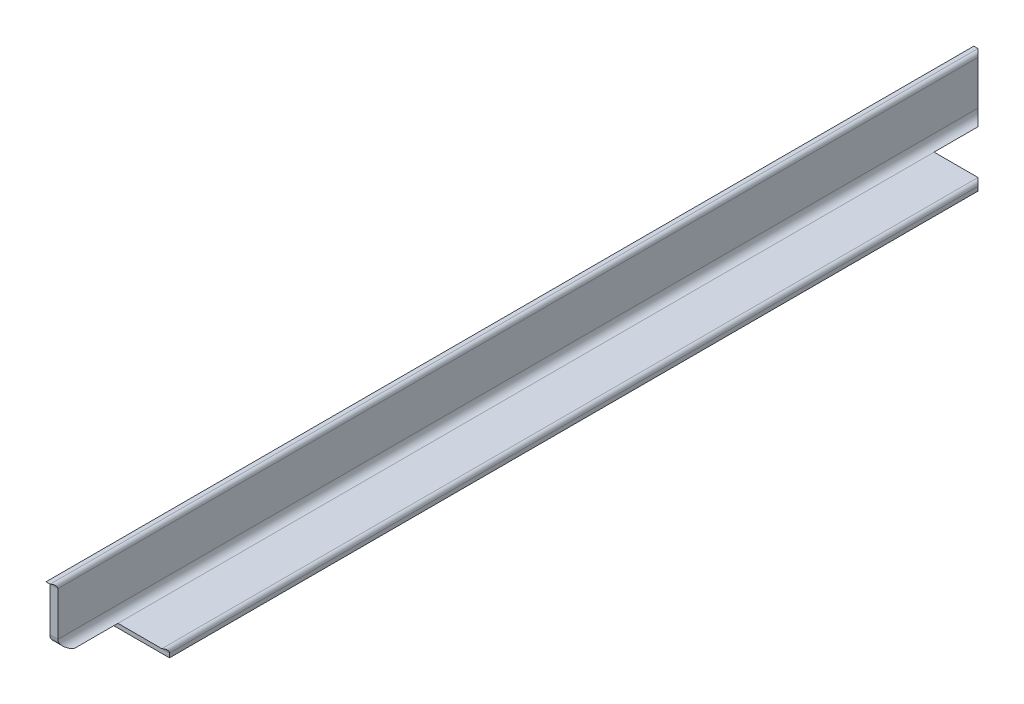
ISO-10303-21;
HEADER;
FILE_DESCRIPTION(('STEP AP214'),'2;1');
FILE_NAME('part.step','',(''),(''),'','','');
FILE_SCHEMA(('AUTOMOTIVE_DESIGN { 1 0 10303 214 1 1 1 1 }'));
ENDSEC;
DATA;
#1=APPLICATION_CONTEXT('core data for automotive mechanical design processes');
#2=APPLICATION_PROTOCOL_DEFINITION('international standard','automotive_design',2000,#1);
#3=PRODUCT_CONTEXT('',#1,'mechanical');
#4=PRODUCT('Part','Part','',(#3));
#5=PRODUCT_RELATED_PRODUCT_CATEGORY('part','',(#4));
#6=PRODUCT_DEFINITION_FORMATION('','',#4);
#7=PRODUCT_DEFINITION_CONTEXT('part definition',#1,'design');
#8=PRODUCT_DEFINITION('design','',#6,#7);
#9=PRODUCT_DEFINITION_SHAPE('','',#8);
#10=(LENGTH_UNIT() NAMED_UNIT(*) SI_UNIT(.MILLI.,.METRE.));
#11=(NAMED_UNIT(*) PLANE_ANGLE_UNIT() SI_UNIT($,.RADIAN.));
#12=(NAMED_UNIT(*) SI_UNIT($,.STERADIAN.) SOLID_ANGLE_UNIT());
#13=UNCERTAINTY_MEASURE_WITH_UNIT(LENGTH_MEASURE(1.E-05),#10,'distance_accuracy_value','');
#14=(GEOMETRIC_REPRESENTATION_CONTEXT(3) GLOBAL_UNCERTAINTY_ASSIGNED_CONTEXT((#13)) GLOBAL_UNIT_ASSIGNED_CONTEXT((#10,
#11,#12)) REPRESENTATION_CONTEXT('',''));
#15=CARTESIAN_POINT('',(0.,0.,0.));
#16=DIRECTION('',(0.,0.,1.));
#17=DIRECTION('',(1.,0.,0.));
#18=AXIS2_PLACEMENT_3D('',#15,#16,#17);
#19=CARTESIAN_POINT('',(498.3479999,4.7624999999999,35.8140000999999));
#20=DIRECTION('',(0.,1.,0.));
#21=DIRECTION('',(0.,0.,1.));
#22=AXIS2_PLACEMENT_3D('',#19,#20,#21);
#23=PLANE('',#22);
#24=DIRECTION('',(0.,0.,1.));
#25=VECTOR('',#24,1.);
#26=CARTESIAN_POINT('',(9.5885,4.7625,9.58850009999965));
#27=LINE('',#26,#25);
#28=CARTESIAN_POINT('',(9.5885,4.7625,9.58850009999965));
#29=VERTEX_POINT('',#28);
#30=CARTESIAN_POINT('',(9.5885,4.76250000000002,35.8140000999996));
#31=VERTEX_POINT('',#30);
#32=EDGE_CURVE('E10',#29,#31,#27,.T.);
#33=ORIENTED_EDGE('',*,*,#32,.T.);
#34=DIRECTION('',(1.,0.,0.));
#35=VECTOR('',#34,1.);
#36=CARTESIAN_POINT('',(0.,4.76250000000002,35.8140000999996));
#37=LINE('',#36,#35);
#38=CARTESIAN_POINT('',(0.,4.76250000000002,35.8140000999996));
#39=VERTEX_POINT('',#38);
#40=EDGE_CURVE('E271',#39,#31,#37,.T.);
#41=ORIENTED_EDGE('',*,*,#40,.F.);
#42=DIRECTION('',(0.,0.,1.));
#43=VECTOR('',#42,1.);
#44=CARTESIAN_POINT('',(0.,4.7625,9.58850009999965));
#45=LINE('',#44,#43);
#46=CARTESIAN_POINT('',(0.,4.7625,9.58850009999965));
#47=VERTEX_POINT('',#46);
#48=EDGE_CURVE('E286',#47,#39,#45,.T.);
#49=ORIENTED_EDGE('',*,*,#48,.F.);
#50=DIRECTION('',(1.,0.,0.));
#51=VECTOR('',#50,1.);
#52=CARTESIAN_POINT('',(0.,4.7625,9.58850009999965));
#53=LINE('',#52,#51);
#54=EDGE_CURVE('E26',#47,#29,#53,.T.);
#55=ORIENTED_EDGE('',*,*,#54,.T.);
#56=EDGE_LOOP('',(#33,#41,#49,#55));
#57=FACE_BOUND('',#56,.T.);
#58=ADVANCED_FACE('F16',(#57),#23,.F.);
#59=CARTESIAN_POINT('',(498.3479999,9.5884999999999,9.5885000999999));
#60=DIRECTION('',(-1.,0.,0.));
#61=DIRECTION('',(0.,0.,1.));
#62=AXIS2_PLACEMENT_3D('',#59,#60,#61);
#63=CYLINDRICAL_SURFACE('',#62,4.826);
#64=CARTESIAN_POINT('',(9.58849999999997,9.5885,9.58850009999965));
#65=DIRECTION('',(0.707106781186546,0.,-0.707106781186549));
#66=DIRECTION('',(-0.707106781186549,0.,-0.707106781186546));
#67=AXIS2_PLACEMENT_3D('',#64,#65,#66);
#68=ELLIPSE('',#67,6.82499465201258,4.826);
#69=CARTESIAN_POINT('',(4.7625,9.5885,4.76250009999965));
#70=VERTEX_POINT('',#69);
#71=EDGE_CURVE('E197',#29,#70,#68,.T.);
#72=ORIENTED_EDGE('',*,*,#71,.F.);
#73=ORIENTED_EDGE('',*,*,#54,.F.);
#74=CARTESIAN_POINT('',(0.,9.5885,9.58850009999965));
#75=DIRECTION('',(-1.,0.,0.));
#76=DIRECTION('',(0.,0.,1.));
#77=AXIS2_PLACEMENT_3D('',#74,#75,#76);
#78=CIRCLE('',#77,4.826);
#79=CARTESIAN_POINT('',(0.,9.5885,4.76250009999965));
#80=VERTEX_POINT('',#79);
#81=EDGE_CURVE('E282',#80,#47,#78,.T.);
#82=ORIENTED_EDGE('',*,*,#81,.F.);
#83=DIRECTION('',(1.,0.,0.));
#84=VECTOR('',#83,1.);
#85=CARTESIAN_POINT('',(0.,9.5885,4.76250009999965));
#86=LINE('',#85,#84);
#87=EDGE_CURVE('E287',#80,#70,#86,.T.);
#88=ORIENTED_EDGE('',*,*,#87,.T.);
#89=EDGE_LOOP('',(#72,#73,#82,#88));
#90=FACE_BOUND('',#89,.T.);
#91=ADVANCED_FACE('F300',(#90),#63,.T.);
#92=CARTESIAN_POINT('',(498.3479999,9.5884999999999,4.7625000999999));
#93=DIRECTION('',(0.,0.,1.));
#94=DIRECTION('',(1.,0.,0.));
#95=AXIS2_PLACEMENT_3D('',#92,#93,#94);
#96=PLANE('',#95);
#97=DIRECTION('',(0.,1.,0.));
#98=VECTOR('',#97,1.);
#99=CARTESIAN_POINT('',(4.7625,9.5885,4.76250009999965));
#100=LINE('',#99,#98);
#101=CARTESIAN_POINT('',(4.7625,35.814,4.76250009999965));
#102=VERTEX_POINT('',#101);
#103=EDGE_CURVE('E200',#70,#102,#100,.T.);
#104=ORIENTED_EDGE('',*,*,#103,.F.);
#105=ORIENTED_EDGE('',*,*,#87,.F.);
#106=DIRECTION('',(0.,-1.,0.));
#107=VECTOR('',#106,1.);
#108=CARTESIAN_POINT('',(0.,35.814,4.76250009999965));
#109=LINE('',#108,#107);
#110=CARTESIAN_POINT('',(0.,35.814,4.76250009999965));
#111=VERTEX_POINT('',#110);
#112=EDGE_CURVE('E285',#111,#80,#109,.T.);
#113=ORIENTED_EDGE('',*,*,#112,.F.);
#114=DIRECTION('',(1.,0.,0.));
#115=VECTOR('',#114,1.);
#116=CARTESIAN_POINT('',(0.,35.814,4.76250009999965));
#117=LINE('',#116,#115);
#118=EDGE_CURVE('E276',#111,#102,#117,.T.);
#119=ORIENTED_EDGE('',*,*,#118,.T.);
#120=EDGE_LOOP('',(#104,#105,#113,#119));
#121=FACE_BOUND('',#120,.T.);
#122=ADVANCED_FACE('F295',(#121),#96,.F.);
#123=CARTESIAN_POINT('',(498.3479999,35.8139999999999,2.4765000999999));
#124=DIRECTION('',(-1.,0.,0.));
#125=DIRECTION('',(0.,0.,1.));
#126=AXIS2_PLACEMENT_3D('',#123,#124,#125);
#127=CYLINDRICAL_SURFACE('',#126,2.286);
#128=CARTESIAN_POINT('',(2.47650000000008,35.814,2.47650009999965));
#129=DIRECTION('',(-0.70710678118655,0.,0.707106781186545));
#130=DIRECTION('',(-0.707106781186545,0.,-0.70710678118655));
#131=AXIS2_PLACEMENT_3D('',#128,#129,#130);
#132=ELLIPSE('',#131,3.23289220358488,2.286);
#133=CARTESIAN_POINT('',(2.4765,38.1,2.47650009999965));
#134=VERTEX_POINT('',#133);
#135=EDGE_CURVE('E207',#102,#134,#132,.T.);
#136=ORIENTED_EDGE('',*,*,#135,.F.);
#137=ORIENTED_EDGE('',*,*,#118,.F.);
#138=CARTESIAN_POINT('',(0.,35.814,2.47650009999965));
#139=DIRECTION('',(1.,0.,0.));
#140=DIRECTION('',(0.,1.,0.));
#141=AXIS2_PLACEMENT_3D('',#138,#139,#140);
#142=CIRCLE('',#141,2.286);
#143=CARTESIAN_POINT('',(0.,38.1,2.47650009999965));
#144=VERTEX_POINT('',#143);
#145=EDGE_CURVE('E224',#144,#111,#142,.T.);
#146=ORIENTED_EDGE('',*,*,#145,.F.);
#147=DIRECTION('',(-1.,0.,0.));
#148=VECTOR('',#147,1.);
#149=CARTESIAN_POINT('',(2.4765,38.1000000000001,2.47650009999965));
#150=LINE('',#149,#148);
#151=EDGE_CURVE('E213',#134,#144,#150,.T.);
#152=ORIENTED_EDGE('',*,*,#151,.F.);
#153=EDGE_LOOP('',(#136,#137,#146,#152));
#154=FACE_BOUND('',#153,.T.);
#155=ADVANCED_FACE('F293',(#154),#127,.F.);
#156=CARTESIAN_POINT('',(498.3479999,2.4764999999999,35.8140000999999));
#157=DIRECTION('',(-1.,0.,0.));
#158=DIRECTION('',(0.,0.,1.));
#159=AXIS2_PLACEMENT_3D('',#156,#157,#158);
#160=CYLINDRICAL_SURFACE('',#159,2.286);
#161=CARTESIAN_POINT('',(35.814,2.4765,35.8140000999997));
#162=DIRECTION('',(-0.707106781186552,0.,0.707106781186543));
#163=DIRECTION('',(-0.707106781186543,0.,-0.707106781186552));
#164=AXIS2_PLACEMENT_3D('',#161,#162,#163);
#165=ELLIPSE('',#164,3.23289220358488,2.286);
#166=CARTESIAN_POINT('',(38.1,2.4765,38.1000000999997));
#167=VERTEX_POINT('',#166);
#168=CARTESIAN_POINT('',(35.814,4.7625,35.8140000999997));
#169=VERTEX_POINT('',#168);
#170=EDGE_CURVE('E144',#167,#169,#165,.T.);
#171=ORIENTED_EDGE('',*,*,#170,.F.);
#172=DIRECTION('',(1.,0.,0.));
#173=VECTOR('',#172,1.);
#174=CARTESIAN_POINT('',(0.,2.47650000000003,38.1000000999996));
#175=LINE('',#174,#173);
#176=CARTESIAN_POINT('',(0.,2.47650000000003,38.1000000999996));
#177=VERTEX_POINT('',#176);
#178=EDGE_CURVE('E269',#177,#167,#175,.T.);
#179=ORIENTED_EDGE('',*,*,#178,.F.);
#180=CARTESIAN_POINT('',(0.,2.47650000000003,35.8140000999996));
#181=DIRECTION('',(1.,0.,0.));
#182=DIRECTION('',(0.,1.,0.));
#183=AXIS2_PLACEMENT_3D('',#180,#181,#182);
#184=CIRCLE('',#183,2.286);
#185=EDGE_CURVE('E191',#39,#177,#184,.T.);
#186=ORIENTED_EDGE('',*,*,#185,.F.);
#187=ORIENTED_EDGE('',*,*,#40,.T.);
#188=DIRECTION('',(-1.,0.,0.));
#189=VECTOR('',#188,1.);
#190=CARTESIAN_POINT('',(35.814,4.76250000000023,35.8140000999997));
#191=LINE('',#190,#189);
#192=EDGE_CURVE('E35',#169,#31,#191,.T.);
#193=ORIENTED_EDGE('',*,*,#192,.F.);
#194=EDGE_LOOP('',(#171,#179,#186,#187,#193));
#195=FACE_BOUND('',#194,.T.);
#196=ADVANCED_FACE('F306',(#195),#160,.F.);
#197=CARTESIAN_POINT('',(498.3479999,-1.018629662E-13,38.1000000999999));
#198=DIRECTION('',(0.,0.,1.));
#199=DIRECTION('',(1.,0.,0.));
#200=AXIS2_PLACEMENT_3D('',#197,#198,#199);
#201=PLANE('',#200);
#202=DIRECTION('',(0.,1.,0.));
#203=VECTOR('',#202,1.);
#204=CARTESIAN_POINT('',(38.1,0.,38.1000000999997));
#205=LINE('',#204,#203);
#206=CARTESIAN_POINT('',(38.1,0.,38.1000000999997));
#207=VERTEX_POINT('',#206);
#208=EDGE_CURVE('E135',#207,#167,#205,.T.);
#209=ORIENTED_EDGE('',*,*,#208,.F.);
#210=DIRECTION('',(1.,0.,0.));
#211=VECTOR('',#210,1.);
#212=CARTESIAN_POINT('',(0.,0.,38.1000000999996));
#213=LINE('',#212,#211);
#214=CARTESIAN_POINT('',(0.,0.,38.1000000999996));
#215=VERTEX_POINT('',#214);
#216=EDGE_CURVE('E155',#215,#207,#213,.T.);
#217=ORIENTED_EDGE('',*,*,#216,.F.);
#218=DIRECTION('',(0.,-1.,0.));
#219=VECTOR('',#218,1.);
#220=CARTESIAN_POINT('',(0.,2.47650000000003,38.1000000999996));
#221=LINE('',#220,#219);
#222=EDGE_CURVE('E161',#177,#215,#221,.T.);
#223=ORIENTED_EDGE('',*,*,#222,.F.);
#224=ORIENTED_EDGE('',*,*,#178,.T.);
#225=EDGE_LOOP('',(#209,#217,#223,#224));
#226=FACE_BOUND('',#225,.T.);
#227=ADVANCED_FACE('F307',(#226),#201,.F.);
#228=CARTESIAN_POINT('',(9.5885,9.5885,0.));
#229=DIRECTION('',(0.,0.,1.));
#230=DIRECTION('',(1.,0.,0.));
#231=AXIS2_PLACEMENT_3D('',#228,#229,#230);
#232=CYLINDRICAL_SURFACE('',#231,4.826);
#233=ORIENTED_EDGE('',*,*,#71,.T.);
#234=DIRECTION('',(0.,0.,1.));
#235=VECTOR('',#234,1.);
#236=CARTESIAN_POINT('',(4.7625,9.5885,4.76250009999965));
#237=LINE('',#236,#235);
#238=CARTESIAN_POINT('',(4.7625,9.58850000000003,554.0374999));
#239=VERTEX_POINT('',#238);
#240=EDGE_CURVE('E194',#70,#239,#237,.T.);
#241=ORIENTED_EDGE('',*,*,#240,.T.);
#242=CARTESIAN_POINT('',(9.58849999999993,9.58850000000003,549.2114999));
#243=DIRECTION('',(0.707106781186547,0.,0.707106781186548));
#244=DIRECTION('',(-0.707106781186548,0.,0.707106781186547));
#245=AXIS2_PLACEMENT_3D('',#242,#243,#244);
#246=ELLIPSE('',#245,6.82499465201256,4.826);
#247=CARTESIAN_POINT('',(9.5885,4.76250000000002,549.2114999));
#248=VERTEX_POINT('',#247);
#249=EDGE_CURVE('E198',#239,#248,#246,.T.);
#250=ORIENTED_EDGE('',*,*,#249,.T.);
#251=DIRECTION('',(0.,0.,1.));
#252=VECTOR('',#251,1.);
#253=CARTESIAN_POINT('',(9.5885,4.7625,522.985999899999));
#254=LINE('',#253,#252);
#255=CARTESIAN_POINT('',(9.58849999999997,4.7625,522.985999899999));
#256=VERTEX_POINT('',#255);
#257=EDGE_CURVE('E178',#256,#248,#254,.T.);
#258=ORIENTED_EDGE('',*,*,#257,.F.);
#259=DIRECTION('',(0.,0.,1.));
#260=VECTOR('',#259,1.);
#261=CARTESIAN_POINT('',(9.5885,4.7625,35.8140000999996));
#262=LINE('',#261,#260);
#263=EDGE_CURVE('E139',#31,#256,#262,.T.);
#264=ORIENTED_EDGE('',*,*,#263,.F.);
#265=ORIENTED_EDGE('',*,*,#32,.F.);
#266=EDGE_LOOP('',(#233,#241,#250,#258,#264,#265));
#267=FACE_BOUND('',#266,.T.);
#268=ADVANCED_FACE('F243',(#267),#232,.F.);
#269=CARTESIAN_POINT('',(4.7625,35.814,0.));
#270=DIRECTION('',(1.,0.,0.));
#271=DIRECTION('',(0.,0.,-1.));
#272=AXIS2_PLACEMENT_3D('',#269,#270,#271);
#273=PLANE('',#272);
#274=ORIENTED_EDGE('',*,*,#103,.T.);
#275=DIRECTION('',(0.,0.,1.));
#276=VECTOR('',#275,1.);
#277=CARTESIAN_POINT('',(4.7625,35.814,4.76250009999965));
#278=LINE('',#277,#276);
#279=CARTESIAN_POINT('',(4.7625,35.814,554.0374999));
#280=VERTEX_POINT('',#279);
#281=EDGE_CURVE('E202',#102,#280,#278,.T.);
#282=ORIENTED_EDGE('',*,*,#281,.T.);
#283=DIRECTION('',(0.,-1.,0.));
#284=VECTOR('',#283,1.);
#285=CARTESIAN_POINT('',(4.7625,35.814,554.0374999));
#286=LINE('',#285,#284);
#287=EDGE_CURVE('E205',#280,#239,#286,.T.);
#288=ORIENTED_EDGE('',*,*,#287,.T.);
#289=ORIENTED_EDGE('',*,*,#240,.F.);
#290=EDGE_LOOP('',(#274,#282,#288,#289));
#291=FACE_BOUND('',#290,.T.);
#292=ADVANCED_FACE('F250',(#291),#273,.T.);
#293=CARTESIAN_POINT('',(2.4765,35.814,0.));
#294=DIRECTION('',(0.,0.,1.));
#295=DIRECTION('',(1.,0.,0.));
#296=AXIS2_PLACEMENT_3D('',#293,#294,#295);
#297=CYLINDRICAL_SURFACE('',#296,2.286);
#298=ORIENTED_EDGE('',*,*,#135,.T.);
#299=DIRECTION('',(0.,0.,1.));
#300=VECTOR('',#299,1.);
#301=CARTESIAN_POINT('',(2.4765,38.1,2.47650009999965));
#302=LINE('',#301,#300);
#303=CARTESIAN_POINT('',(2.4765,38.1,556.3234999));
#304=VERTEX_POINT('',#303);
#305=EDGE_CURVE('E208',#134,#304,#302,.T.);
#306=ORIENTED_EDGE('',*,*,#305,.T.);
#307=CARTESIAN_POINT('',(2.47649999999992,35.814,556.3234999));
#308=DIRECTION('',(-0.707106781186546,0.,-0.707106781186549));
#309=DIRECTION('',(-0.707106781186549,0.,0.707106781186546));
#310=AXIS2_PLACEMENT_3D('',#307,#308,#309);
#311=ELLIPSE('',#310,3.23289220358491,2.286);
#312=EDGE_CURVE('E211',#304,#280,#311,.T.);
#313=ORIENTED_EDGE('',*,*,#312,.T.);
#314=ORIENTED_EDGE('',*,*,#281,.F.);
#315=EDGE_LOOP('',(#298,#306,#313,#314));
#316=FACE_BOUND('',#315,.T.);
#317=ADVANCED_FACE('F291',(#316),#297,.T.);
#318=CARTESIAN_POINT('',(0.,38.1,0.));
#319=DIRECTION('',(0.,1.,0.));
#320=DIRECTION('',(0.,0.,1.));
#321=AXIS2_PLACEMENT_3D('',#318,#319,#320);
#322=PLANE('',#321);
#323=ORIENTED_EDGE('',*,*,#151,.T.);
#324=DIRECTION('',(0.,0.,1.));
#325=VECTOR('',#324,1.);
#326=CARTESIAN_POINT('',(0.,38.1,2.47650009999965));
#327=LINE('',#326,#325);
#328=CARTESIAN_POINT('',(0.,38.1,556.3234999));
#329=VERTEX_POINT('',#328);
#330=EDGE_CURVE('E214',#144,#329,#327,.T.);
#331=ORIENTED_EDGE('',*,*,#330,.T.);
#332=DIRECTION('',(-1.,0.,0.));
#333=VECTOR('',#332,1.);
#334=CARTESIAN_POINT('',(2.4765,38.1000000000001,556.3234999));
#335=LINE('',#334,#333);
#336=EDGE_CURVE('E218',#304,#329,#335,.T.);
#337=ORIENTED_EDGE('',*,*,#336,.F.);
#338=ORIENTED_EDGE('',*,*,#305,.F.);
#339=EDGE_LOOP('',(#323,#331,#337,#338));
#340=FACE_BOUND('',#339,.T.);
#341=ADVANCED_FACE('F263',(#340),#322,.T.);
#342=CARTESIAN_POINT('',(498.3479999,35.8139999999999,556.3234999));
#343=DIRECTION('',(-1.,0.,0.));
#344=DIRECTION('',(0.,0.,1.));
#345=AXIS2_PLACEMENT_3D('',#342,#343,#344);
#346=CYLINDRICAL_SURFACE('',#345,2.286);
#347=CARTESIAN_POINT('',(-2.8421711E-13,35.814,556.3234999));
#348=DIRECTION('',(1.,0.,0.));
#349=DIRECTION('',(0.,1.,0.));
#350=AXIS2_PLACEMENT_3D('',#347,#348,#349);
#351=CIRCLE('',#350,2.286);
#352=CARTESIAN_POINT('',(0.,35.814,554.0374999));
#353=VERTEX_POINT('',#352);
#354=EDGE_CURVE('E220',#353,#329,#351,.T.);
#355=ORIENTED_EDGE('',*,*,#354,.F.);
#356=DIRECTION('',(1.,0.,0.));
#357=VECTOR('',#356,1.);
#358=CARTESIAN_POINT('',(0.,35.814,554.0374999));
#359=LINE('',#358,#357);
#360=EDGE_CURVE('E217',#353,#280,#359,.T.);
#361=ORIENTED_EDGE('',*,*,#360,.T.);
#362=ORIENTED_EDGE('',*,*,#312,.F.);
#363=ORIENTED_EDGE('',*,*,#336,.T.);
#364=EDGE_LOOP('',(#355,#361,#362,#363));
#365=FACE_BOUND('',#364,.T.);
#366=ADVANCED_FACE('F256',(#365),#346,.F.);
#367=CARTESIAN_POINT('',(498.3479999,35.8139999999999,554.0374999));
#368=DIRECTION('',(0.,0.,-1.));
#369=DIRECTION('',(-1.,0.,0.));
#370=AXIS2_PLACEMENT_3D('',#367,#368,#369);
#371=PLANE('',#370);
#372=DIRECTION('',(0.,1.,0.));
#373=VECTOR('',#372,1.);
#374=CARTESIAN_POINT('',(0.,9.58850000000003,554.0374999));
#375=LINE('',#374,#373);
#376=CARTESIAN_POINT('',(0.,9.58850000000003,554.0374999));
#377=VERTEX_POINT('',#376);
#378=EDGE_CURVE('E223',#377,#353,#375,.T.);
#379=ORIENTED_EDGE('',*,*,#378,.F.);
#380=DIRECTION('',(1.,0.,0.));
#381=VECTOR('',#380,1.);
#382=CARTESIAN_POINT('',(0.,9.58850000000003,554.0374999));
#383=LINE('',#382,#381);
#384=EDGE_CURVE('E173',#377,#239,#383,.T.);
#385=ORIENTED_EDGE('',*,*,#384,.T.);
#386=ORIENTED_EDGE('',*,*,#287,.F.);
#387=ORIENTED_EDGE('',*,*,#360,.F.);
#388=EDGE_LOOP('',(#379,#385,#386,#387));
#389=FACE_BOUND('',#388,.T.);
#390=ADVANCED_FACE('F232',(#389),#371,.F.);
#391=CARTESIAN_POINT('',(498.3479999,2.4764999999999,520.6999999));
#392=DIRECTION('',(0.,0.,-1.));
#393=DIRECTION('',(-1.,0.,0.));
#394=AXIS2_PLACEMENT_3D('',#391,#392,#393);
#395=PLANE('',#394);
#396=DIRECTION('',(0.,1.,0.));
#397=VECTOR('',#396,1.);
#398=CARTESIAN_POINT('',(0.,0.,520.6999999));
#399=LINE('',#398,#397);
#400=CARTESIAN_POINT('',(0.,0.,520.6999999));
#401=VERTEX_POINT('',#400);
#402=CARTESIAN_POINT('',(0.,2.4765,520.6999999));
#403=VERTEX_POINT('',#402);
#404=EDGE_CURVE('E168',#401,#403,#399,.T.);
#405=ORIENTED_EDGE('',*,*,#404,.F.);
#406=DIRECTION('',(-1.,0.,0.));
#407=VECTOR('',#406,1.);
#408=CARTESIAN_POINT('',(38.1,0.,520.6999999));
#409=LINE('',#408,#407);
#410=CARTESIAN_POINT('',(38.1,0.,520.6999999));
#411=VERTEX_POINT('',#410);
#412=EDGE_CURVE('E156',#411,#401,#409,.T.);
#413=ORIENTED_EDGE('',*,*,#412,.F.);
#414=DIRECTION('',(0.,-1.,0.));
#415=VECTOR('',#414,1.);
#416=CARTESIAN_POINT('',(38.1,2.4765,520.6999999));
#417=LINE('',#416,#415);
#418=CARTESIAN_POINT('',(38.1,2.4765,520.6999999));
#419=VERTEX_POINT('',#418);
#420=EDGE_CURVE('E152',#419,#411,#417,.T.);
#421=ORIENTED_EDGE('',*,*,#420,.F.);
#422=DIRECTION('',(1.,0.,0.));
#423=VECTOR('',#422,1.);
#424=CARTESIAN_POINT('',(0.,2.4765,520.6999999));
#425=LINE('',#424,#423);
#426=EDGE_CURVE('E129',#403,#419,#425,.T.);
#427=ORIENTED_EDGE('',*,*,#426,.F.);
#428=EDGE_LOOP('',(#405,#413,#421,#427));
#429=FACE_BOUND('',#428,.T.);
#430=ADVANCED_FACE('F310',(#429),#395,.F.);
#431=CARTESIAN_POINT('',(498.3479999,2.4764999999999,522.9859999));
#432=DIRECTION('',(-1.,0.,0.));
#433=DIRECTION('',(0.,0.,1.));
#434=AXIS2_PLACEMENT_3D('',#431,#432,#433);
#435=CYLINDRICAL_SURFACE('',#434,2.286);
#436=CARTESIAN_POINT('',(-2.8421711E-13,2.4765,522.985999899999));
#437=DIRECTION('',(1.,0.,0.));
#438=DIRECTION('',(0.,1.,0.));
#439=AXIS2_PLACEMENT_3D('',#436,#437,#438);
#440=CIRCLE('',#439,2.286);
#441=CARTESIAN_POINT('',(0.,4.7625,522.985999899999));
#442=VERTEX_POINT('',#441);
#443=EDGE_CURVE('E174',#403,#442,#440,.T.);
#444=ORIENTED_EDGE('',*,*,#443,.F.);
#445=ORIENTED_EDGE('',*,*,#426,.T.);
#446=CARTESIAN_POINT('',(35.814,2.4765,522.9859999));
#447=DIRECTION('',(-0.707106781186543,0.,-0.707106781186552));
#448=DIRECTION('',(-0.707106781186552,0.,0.707106781186543));
#449=AXIS2_PLACEMENT_3D('',#446,#447,#448);
#450=ELLIPSE('',#449,3.23289220358491,2.286);
#451=CARTESIAN_POINT('',(35.814,4.7625,522.9859999));
#452=VERTEX_POINT('',#451);
#453=EDGE_CURVE('E121',#452,#419,#450,.T.);
#454=ORIENTED_EDGE('',*,*,#453,.F.);
#455=DIRECTION('',(-1.,0.,0.));
#456=VECTOR('',#455,1.);
#457=CARTESIAN_POINT('',(35.814,4.76250000000023,522.9859999));
#458=LINE('',#457,#456);
#459=EDGE_CURVE('E126',#452,#256,#458,.T.);
#460=ORIENTED_EDGE('',*,*,#459,.T.);
#461=DIRECTION('',(1.,0.,0.));
#462=VECTOR('',#461,1.);
#463=CARTESIAN_POINT('',(0.,4.7625,522.9859999));
#464=LINE('',#463,#462);
#465=EDGE_CURVE('E141',#442,#256,#464,.T.);
#466=ORIENTED_EDGE('',*,*,#465,.F.);
#467=EDGE_LOOP('',(#444,#445,#454,#460,#466));
#468=FACE_BOUND('',#467,.T.);
#469=ADVANCED_FACE('F124',(#468),#435,.F.);
#470=CARTESIAN_POINT('',(498.3479999,4.7624999999999,549.2114999));
#471=DIRECTION('',(0.,1.,0.));
#472=DIRECTION('',(0.,0.,1.));
#473=AXIS2_PLACEMENT_3D('',#470,#471,#472);
#474=PLANE('',#473);
#475=DIRECTION('',(0.,0.,1.));
#476=VECTOR('',#475,1.);
#477=CARTESIAN_POINT('',(0.,4.7625,522.985999899999));
#478=LINE('',#477,#476);
#479=CARTESIAN_POINT('',(0.,4.76250000000002,549.2114999));
#480=VERTEX_POINT('',#479);
#481=EDGE_CURVE('E175',#442,#480,#478,.T.);
#482=ORIENTED_EDGE('',*,*,#481,.F.);
#483=ORIENTED_EDGE('',*,*,#465,.T.);
#484=ORIENTED_EDGE('',*,*,#257,.T.);
#485=DIRECTION('',(1.,0.,0.));
#486=VECTOR('',#485,1.);
#487=CARTESIAN_POINT('',(0.,4.76250000000002,549.2114999));
#488=LINE('',#487,#486);
#489=EDGE_CURVE('E180',#480,#248,#488,.T.);
#490=ORIENTED_EDGE('',*,*,#489,.F.);
#491=EDGE_LOOP('',(#482,#483,#484,#490));
#492=FACE_BOUND('',#491,.T.);
#493=ADVANCED_FACE('F240',(#492),#474,.F.);
#494=CARTESIAN_POINT('',(498.3479999,9.5884999999999,549.2114999));
#495=DIRECTION('',(-1.,0.,0.));
#496=DIRECTION('',(0.,0.,1.));
#497=AXIS2_PLACEMENT_3D('',#494,#495,#496);
#498=CYLINDRICAL_SURFACE('',#497,4.826);
#499=CARTESIAN_POINT('',(-2.8421711E-13,9.58850000000003,549.2114999));
#500=DIRECTION('',(-1.,0.,0.));
#501=DIRECTION('',(0.,0.,1.));
#502=AXIS2_PLACEMENT_3D('',#499,#500,#501);
#503=CIRCLE('',#502,4.826);
#504=EDGE_CURVE('E149',#480,#377,#503,.T.);
#505=ORIENTED_EDGE('',*,*,#504,.F.);
#506=ORIENTED_EDGE('',*,*,#489,.T.);
#507=ORIENTED_EDGE('',*,*,#249,.F.);
#508=ORIENTED_EDGE('',*,*,#384,.F.);
#509=EDGE_LOOP('',(#505,#506,#507,#508));
#510=FACE_BOUND('',#509,.T.);
#511=ADVANCED_FACE('F235',(#510),#498,.T.);
#512=CARTESIAN_POINT('',(9.5885,4.7625,0.));
#513=DIRECTION('',(0.,1.,0.));
#514=DIRECTION('',(0.,0.,1.));
#515=AXIS2_PLACEMENT_3D('',#512,#513,#514);
#516=PLANE('',#515);
#517=ORIENTED_EDGE('',*,*,#192,.T.);
#518=ORIENTED_EDGE('',*,*,#263,.T.);
#519=ORIENTED_EDGE('',*,*,#459,.F.);
#520=DIRECTION('',(0.,0.,1.));
#521=VECTOR('',#520,1.);
#522=CARTESIAN_POINT('',(35.814,4.7625,35.8140000999997));
#523=LINE('',#522,#521);
#524=EDGE_CURVE('E134',#169,#452,#523,.T.);
#525=ORIENTED_EDGE('',*,*,#524,.F.);
#526=EDGE_LOOP('',(#517,#518,#519,#525));
#527=FACE_BOUND('',#526,.T.);
#528=ADVANCED_FACE('F137',(#527),#516,.T.);
#529=CARTESIAN_POINT('',(35.814,2.47650000000003,0.));
#530=DIRECTION('',(0.,0.,1.));
#531=DIRECTION('',(1.,0.,0.));
#532=AXIS2_PLACEMENT_3D('',#529,#530,#531);
#533=CYLINDRICAL_SURFACE('',#532,2.286);
#534=ORIENTED_EDGE('',*,*,#170,.T.);
#535=ORIENTED_EDGE('',*,*,#524,.T.);
#536=ORIENTED_EDGE('',*,*,#453,.T.);
#537=DIRECTION('',(0.,0.,1.));
#538=VECTOR('',#537,1.);
#539=CARTESIAN_POINT('',(38.1,2.47650000000003,38.1000000999997));
#540=LINE('',#539,#538);
#541=EDGE_CURVE('E151',#167,#419,#540,.T.);
#542=ORIENTED_EDGE('',*,*,#541,.F.);
#543=EDGE_LOOP('',(#534,#535,#536,#542));
#544=FACE_BOUND('',#543,.T.);
#545=ADVANCED_FACE('F18',(#544),#533,.T.);
#546=CARTESIAN_POINT('',(38.1,2.47650000000003,0.));
#547=DIRECTION('',(1.,0.,0.));
#548=DIRECTION('',(0.,0.,-1.));
#549=AXIS2_PLACEMENT_3D('',#546,#547,#548);
#550=PLANE('',#549);
#551=ORIENTED_EDGE('',*,*,#208,.T.);
#552=ORIENTED_EDGE('',*,*,#541,.T.);
#553=ORIENTED_EDGE('',*,*,#420,.T.);
#554=DIRECTION('',(0.,0.,1.));
#555=VECTOR('',#554,1.);
#556=CARTESIAN_POINT('',(38.1,0.,38.1000000999997));
#557=LINE('',#556,#555);
#558=EDGE_CURVE('E153',#207,#411,#557,.T.);
#559=ORIENTED_EDGE('',*,*,#558,.F.);
#560=EDGE_LOOP('',(#551,#552,#553,#559));
#561=FACE_BOUND('',#560,.T.);
#562=ADVANCED_FACE('F312',(#561),#550,.T.);
#563=CARTESIAN_POINT('',(38.1,0.,0.));
#564=DIRECTION('',(0.,-1.,0.));
#565=DIRECTION('',(0.,0.,-1.));
#566=AXIS2_PLACEMENT_3D('',#563,#564,#565);
#567=PLANE('',#566);
#568=ORIENTED_EDGE('',*,*,#216,.T.);
#569=ORIENTED_EDGE('',*,*,#558,.T.);
#570=ORIENTED_EDGE('',*,*,#412,.T.);
#571=DIRECTION('',(0.,0.,1.));
#572=VECTOR('',#571,1.);
#573=CARTESIAN_POINT('',(0.,0.,38.1000000999996));
#574=LINE('',#573,#572);
#575=EDGE_CURVE('E20',#215,#401,#574,.T.);
#576=ORIENTED_EDGE('',*,*,#575,.F.);
#577=EDGE_LOOP('',(#568,#569,#570,#576));
#578=FACE_BOUND('',#577,.T.);
#579=ADVANCED_FACE('F308',(#578),#567,.T.);
#580=CARTESIAN_POINT('',(0.,0.,0.));
#581=DIRECTION('',(-1.,0.,0.));
#582=DIRECTION('',(0.,0.,1.));
#583=AXIS2_PLACEMENT_3D('',#580,#581,#582);
#584=PLANE('',#583);
#585=ORIENTED_EDGE('',*,*,#222,.T.);
#586=ORIENTED_EDGE('',*,*,#575,.T.);
#587=ORIENTED_EDGE('',*,*,#404,.T.);
#588=ORIENTED_EDGE('',*,*,#443,.T.);
#589=ORIENTED_EDGE('',*,*,#481,.T.);
#590=ORIENTED_EDGE('',*,*,#504,.T.);
#591=ORIENTED_EDGE('',*,*,#378,.T.);
#592=ORIENTED_EDGE('',*,*,#354,.T.);
#593=ORIENTED_EDGE('',*,*,#330,.F.);
#594=ORIENTED_EDGE('',*,*,#145,.T.);
#595=ORIENTED_EDGE('',*,*,#112,.T.);
#596=ORIENTED_EDGE('',*,*,#81,.T.);
#597=ORIENTED_EDGE('',*,*,#48,.T.);
#598=ORIENTED_EDGE('',*,*,#185,.T.);
#599=EDGE_LOOP('',(#585,#586,#587,#588,#589,#590,#591,#592,#593,#594,#595,#596,#597,#598));
#600=FACE_BOUND('',#599,.T.);
#601=ADVANCED_FACE('F237',(#600),#584,.T.);
#602=CLOSED_SHELL('',(#58,#91,#122,#155,#196,#227,#268,#292,#317,#341,#366,#390,#430,#469,#493,
#511,#528,#545,#562,#579,#601));
#603=MANIFOLD_SOLID_BREP('B1',#602);
#604=ADVANCED_BREP_SHAPE_REPRESENTATION('',(#18,#603),#14);
#605=SHAPE_DEFINITION_REPRESENTATION(#9,#604);
ENDSEC;
END-ISO-10303-21;
